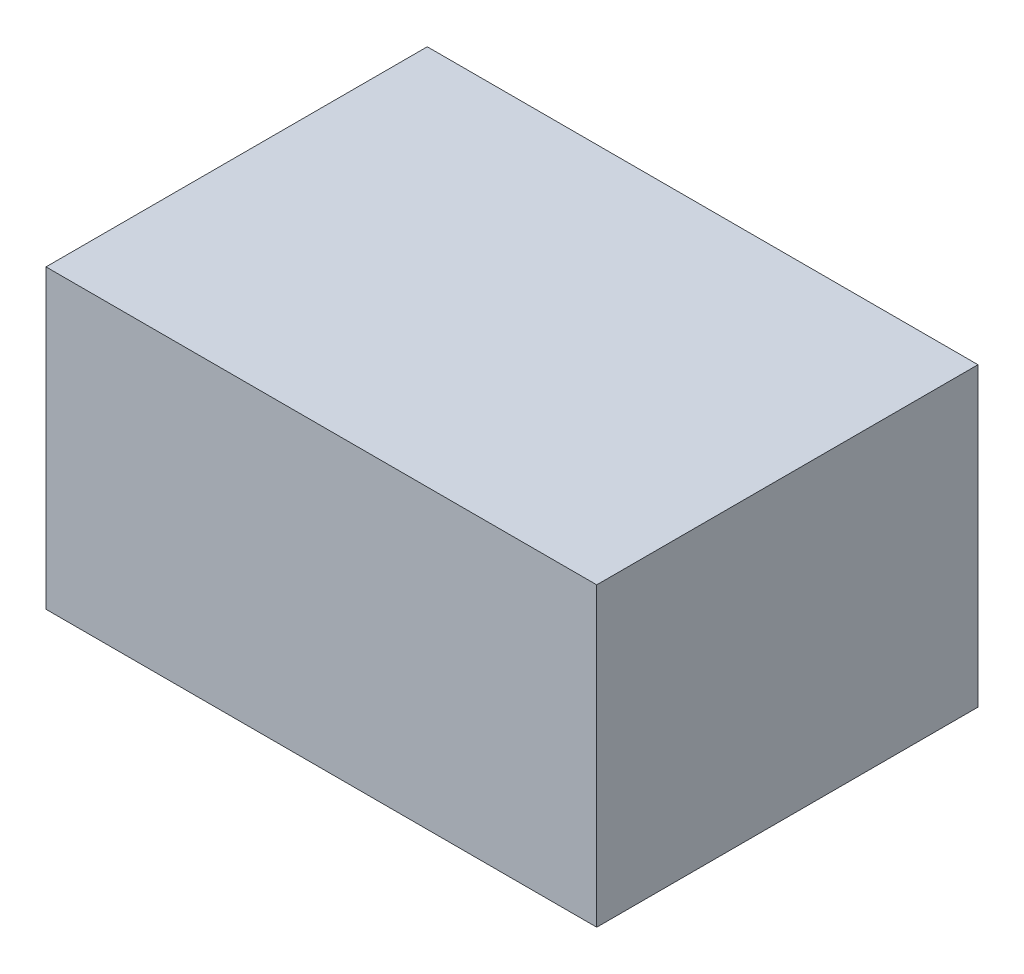
ISO-10303-21;
HEADER;
FILE_DESCRIPTION(('STEP AP214'),'2;1');
FILE_NAME('part.step','',(''),(''),'','','');
FILE_SCHEMA(('AUTOMOTIVE_DESIGN { 1 0 10303 214 1 1 1 1 }'));
ENDSEC;
DATA;
#1=APPLICATION_CONTEXT('core data for automotive mechanical design processes');
#2=APPLICATION_PROTOCOL_DEFINITION('international standard','automotive_design',2000,#1);
#3=PRODUCT_CONTEXT('',#1,'mechanical');
#4=PRODUCT('Part','Part','',(#3));
#5=PRODUCT_RELATED_PRODUCT_CATEGORY('part','',(#4));
#6=PRODUCT_DEFINITION_FORMATION('','',#4);
#7=PRODUCT_DEFINITION_CONTEXT('part definition',#1,'design');
#8=PRODUCT_DEFINITION('design','',#6,#7);
#9=PRODUCT_DEFINITION_SHAPE('','',#8);
#10=(LENGTH_UNIT() NAMED_UNIT(*) SI_UNIT(.MILLI.,.METRE.));
#11=(NAMED_UNIT(*) PLANE_ANGLE_UNIT() SI_UNIT($,.RADIAN.));
#12=(NAMED_UNIT(*) SI_UNIT($,.STERADIAN.) SOLID_ANGLE_UNIT());
#13=UNCERTAINTY_MEASURE_WITH_UNIT(LENGTH_MEASURE(1.E-05),#10,'distance_accuracy_value','');
#14=(GEOMETRIC_REPRESENTATION_CONTEXT(3) GLOBAL_UNCERTAINTY_ASSIGNED_CONTEXT((#13)) GLOBAL_UNIT_ASSIGNED_CONTEXT((#10,
#11,#12)) REPRESENTATION_CONTEXT('',''));
#15=CARTESIAN_POINT('',(0.,0.,0.));
#16=DIRECTION('',(0.,0.,1.));
#17=DIRECTION('',(1.,0.,0.));
#18=AXIS2_PLACEMENT_3D('',#15,#16,#17);
#19=CARTESIAN_POINT('',(10.31875,11.1125,-7.14375));
#20=DIRECTION('',(-1.,0.,0.));
#21=DIRECTION('',(0.,0.,1.));
#22=AXIS2_PLACEMENT_3D('',#19,#20,#21);
#23=PLANE('',#22);
#24=DIRECTION('',(0.,0.,-1.));
#25=VECTOR('',#24,1.);
#26=CARTESIAN_POINT('',(10.31875,0.,-7.14375));
#27=LINE('',#26,#25);
#28=CARTESIAN_POINT('',(10.31875,0.,7.14375));
#29=VERTEX_POINT('',#28);
#30=CARTESIAN_POINT('',(10.31875,0.,-7.14375));
#31=VERTEX_POINT('',#30);
#32=EDGE_CURVE('E98',#29,#31,#27,.T.);
#33=ORIENTED_EDGE('',*,*,#32,.T.);
#34=DIRECTION('',(0.,-1.,0.));
#35=VECTOR('',#34,1.);
#36=CARTESIAN_POINT('',(10.31875,11.1125,-7.14375));
#37=LINE('',#36,#35);
#38=CARTESIAN_POINT('',(10.31875,11.1125,-7.14375));
#39=VERTEX_POINT('',#38);
#40=EDGE_CURVE('E11',#39,#31,#37,.T.);
#41=ORIENTED_EDGE('',*,*,#40,.F.);
#42=DIRECTION('',(0.,0.,-1.));
#43=VECTOR('',#42,1.);
#44=CARTESIAN_POINT('',(10.31875,11.1125,-7.14375));
#45=LINE('',#44,#43);
#46=CARTESIAN_POINT('',(10.31875,11.1125,7.14375));
#47=VERTEX_POINT('',#46);
#48=EDGE_CURVE('E86',#47,#39,#45,.T.);
#49=ORIENTED_EDGE('',*,*,#48,.F.);
#50=DIRECTION('',(0.,-1.,0.));
#51=VECTOR('',#50,1.);
#52=CARTESIAN_POINT('',(10.31875,11.1125,7.14375));
#53=LINE('',#52,#51);
#54=EDGE_CURVE('E94',#47,#29,#53,.T.);
#55=ORIENTED_EDGE('',*,*,#54,.T.);
#56=EDGE_LOOP('',(#33,#41,#49,#55));
#57=FACE_BOUND('',#56,.T.);
#58=ADVANCED_FACE('F35',(#57),#23,.F.);
#59=CARTESIAN_POINT('',(-10.31875,11.1125,-7.14375));
#60=DIRECTION('',(0.,0.,1.));
#61=DIRECTION('',(1.,0.,0.));
#62=AXIS2_PLACEMENT_3D('',#59,#60,#61);
#63=PLANE('',#62);
#64=DIRECTION('',(-1.,0.,0.));
#65=VECTOR('',#64,1.);
#66=CARTESIAN_POINT('',(-10.31875,0.,-7.14375));
#67=LINE('',#66,#65);
#68=CARTESIAN_POINT('',(-10.31875,0.,-7.14375));
#69=VERTEX_POINT('',#68);
#70=EDGE_CURVE('E90',#31,#69,#67,.T.);
#71=ORIENTED_EDGE('',*,*,#70,.T.);
#72=DIRECTION('',(0.,-1.,0.));
#73=VECTOR('',#72,1.);
#74=CARTESIAN_POINT('',(-10.31875,11.1125,-7.14375));
#75=LINE('',#74,#73);
#76=CARTESIAN_POINT('',(-10.31875,11.1125,-7.14375));
#77=VERTEX_POINT('',#76);
#78=EDGE_CURVE('E43',#77,#69,#75,.T.);
#79=ORIENTED_EDGE('',*,*,#78,.F.);
#80=DIRECTION('',(-1.,0.,0.));
#81=VECTOR('',#80,1.);
#82=CARTESIAN_POINT('',(-10.31875,11.1125,-7.14375));
#83=LINE('',#82,#81);
#84=EDGE_CURVE('E81',#39,#77,#83,.T.);
#85=ORIENTED_EDGE('',*,*,#84,.F.);
#86=ORIENTED_EDGE('',*,*,#40,.T.);
#87=EDGE_LOOP('',(#71,#79,#85,#86));
#88=FACE_BOUND('',#87,.T.);
#89=ADVANCED_FACE('F89',(#88),#63,.F.);
#90=CARTESIAN_POINT('',(-10.31875,11.1125,-7.14375));
#91=DIRECTION('',(1.,0.,0.));
#92=DIRECTION('',(0.,0.,-1.));
#93=AXIS2_PLACEMENT_3D('',#90,#91,#92);
#94=PLANE('',#93);
#95=DIRECTION('',(0.,0.,1.));
#96=VECTOR('',#95,1.);
#97=CARTESIAN_POINT('',(-10.31875,0.,-7.14375));
#98=LINE('',#97,#96);
#99=CARTESIAN_POINT('',(-10.31875,0.,7.14375));
#100=VERTEX_POINT('',#99);
#101=EDGE_CURVE('E68',#69,#100,#98,.T.);
#102=ORIENTED_EDGE('',*,*,#101,.T.);
#103=DIRECTION('',(0.,-1.,0.));
#104=VECTOR('',#103,1.);
#105=CARTESIAN_POINT('',(-10.31875,11.1125,7.14375));
#106=LINE('',#105,#104);
#107=CARTESIAN_POINT('',(-10.31875,11.1125,7.14375));
#108=VERTEX_POINT('',#107);
#109=EDGE_CURVE('E91',#108,#100,#106,.T.);
#110=ORIENTED_EDGE('',*,*,#109,.F.);
#111=DIRECTION('',(0.,0.,1.));
#112=VECTOR('',#111,1.);
#113=CARTESIAN_POINT('',(-10.31875,11.1125,-7.14375));
#114=LINE('',#113,#112);
#115=EDGE_CURVE('E84',#77,#108,#114,.T.);
#116=ORIENTED_EDGE('',*,*,#115,.F.);
#117=ORIENTED_EDGE('',*,*,#78,.T.);
#118=EDGE_LOOP('',(#102,#110,#116,#117));
#119=FACE_BOUND('',#118,.T.);
#120=ADVANCED_FACE('F92',(#119),#94,.F.);
#121=CARTESIAN_POINT('',(-10.31875,11.1125,7.14375));
#122=DIRECTION('',(0.,0.,-1.));
#123=DIRECTION('',(-1.,0.,0.));
#124=AXIS2_PLACEMENT_3D('',#121,#122,#123);
#125=PLANE('',#124);
#126=DIRECTION('',(1.,0.,0.));
#127=VECTOR('',#126,1.);
#128=CARTESIAN_POINT('',(-10.31875,0.,7.14375));
#129=LINE('',#128,#127);
#130=EDGE_CURVE('E74',#100,#29,#129,.T.);
#131=ORIENTED_EDGE('',*,*,#130,.T.);
#132=ORIENTED_EDGE('',*,*,#54,.F.);
#133=DIRECTION('',(1.,0.,0.));
#134=VECTOR('',#133,1.);
#135=CARTESIAN_POINT('',(-10.31875,11.1125,7.14375));
#136=LINE('',#135,#134);
#137=EDGE_CURVE('E51',#108,#47,#136,.T.);
#138=ORIENTED_EDGE('',*,*,#137,.F.);
#139=ORIENTED_EDGE('',*,*,#109,.T.);
#140=EDGE_LOOP('',(#131,#132,#138,#139));
#141=FACE_BOUND('',#140,.T.);
#142=ADVANCED_FACE('F105',(#141),#125,.F.);
#143=CARTESIAN_POINT('',(0.,11.1125,0.));
#144=DIRECTION('',(0.,1.,0.));
#145=DIRECTION('',(0.,0.,1.));
#146=AXIS2_PLACEMENT_3D('',#143,#144,#145);
#147=PLANE('',#146);
#148=ORIENTED_EDGE('',*,*,#48,.T.);
#149=ORIENTED_EDGE('',*,*,#84,.T.);
#150=ORIENTED_EDGE('',*,*,#115,.T.);
#151=ORIENTED_EDGE('',*,*,#137,.T.);
#152=EDGE_LOOP('',(#148,#149,#150,#151));
#153=FACE_BOUND('',#152,.T.);
#154=ADVANCED_FACE('F82',(#153),#147,.T.);
#155=CARTESIAN_POINT('',(0.,0.,0.));
#156=DIRECTION('',(0.,1.,0.));
#157=DIRECTION('',(0.,0.,1.));
#158=AXIS2_PLACEMENT_3D('',#155,#156,#157);
#159=PLANE('',#158);
#160=ORIENTED_EDGE('',*,*,#32,.F.);
#161=ORIENTED_EDGE('',*,*,#130,.F.);
#162=ORIENTED_EDGE('',*,*,#101,.F.);
#163=ORIENTED_EDGE('',*,*,#70,.F.);
#164=EDGE_LOOP('',(#160,#161,#162,#163));
#165=FACE_BOUND('',#164,.T.);
#166=ADVANCED_FACE('F108',(#165),#159,.F.);
#167=CLOSED_SHELL('',(#58,#89,#120,#142,#154,#166));
#168=MANIFOLD_SOLID_BREP('B2',#167);
#169=ADVANCED_BREP_SHAPE_REPRESENTATION('',(#18,#168),#14);
#170=SHAPE_DEFINITION_REPRESENTATION(#9,#169);
ENDSEC;
END-ISO-10303-21;
